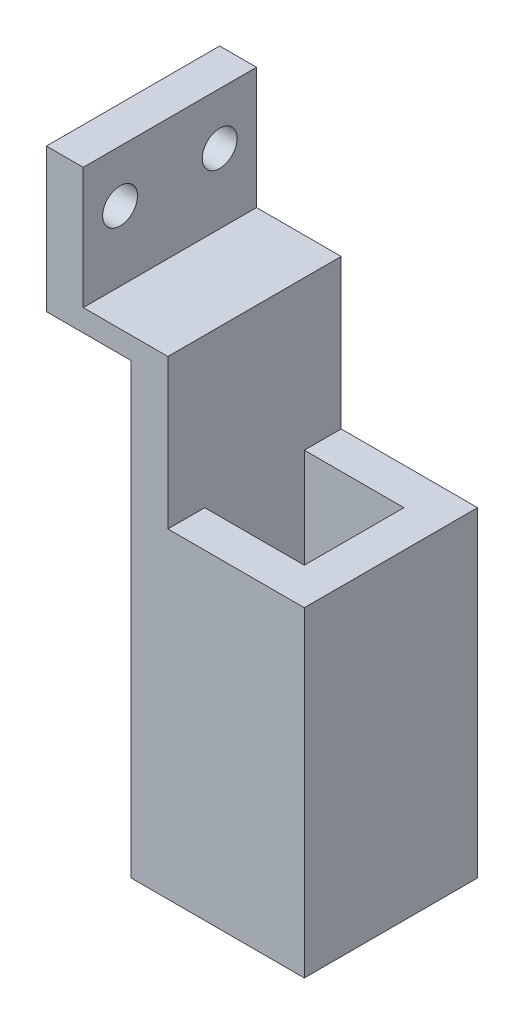
ISO-10303-21;
HEADER;
FILE_DESCRIPTION(('STEP AP214'),'2;1');
FILE_NAME('part.step','',(''),(''),'','','');
FILE_SCHEMA(('AUTOMOTIVE_DESIGN { 1 0 10303 214 1 1 1 1 }'));
ENDSEC;
DATA;
#1=APPLICATION_CONTEXT('core data for automotive mechanical design processes');
#2=APPLICATION_PROTOCOL_DEFINITION('international standard','automotive_design',2000,#1);
#3=PRODUCT_CONTEXT('',#1,'mechanical');
#4=PRODUCT('Part','Part','',(#3));
#5=PRODUCT_RELATED_PRODUCT_CATEGORY('part','',(#4));
#6=PRODUCT_DEFINITION_FORMATION('','',#4);
#7=PRODUCT_DEFINITION_CONTEXT('part definition',#1,'design');
#8=PRODUCT_DEFINITION('design','',#6,#7);
#9=PRODUCT_DEFINITION_SHAPE('','',#8);
#10=(LENGTH_UNIT() NAMED_UNIT(*) SI_UNIT(.MILLI.,.METRE.));
#11=(NAMED_UNIT(*) PLANE_ANGLE_UNIT() SI_UNIT($,.RADIAN.));
#12=(NAMED_UNIT(*) SI_UNIT($,.STERADIAN.) SOLID_ANGLE_UNIT());
#13=UNCERTAINTY_MEASURE_WITH_UNIT(LENGTH_MEASURE(1.E-05),#10,'distance_accuracy_value','');
#14=(GEOMETRIC_REPRESENTATION_CONTEXT(3) GLOBAL_UNCERTAINTY_ASSIGNED_CONTEXT((#13)) GLOBAL_UNIT_ASSIGNED_CONTEXT((#10,
#11,#12)) REPRESENTATION_CONTEXT('',''));
#15=CARTESIAN_POINT('',(0.,0.,0.));
#16=DIRECTION('',(0.,0.,1.));
#17=DIRECTION('',(1.,0.,0.));
#18=AXIS2_PLACEMENT_3D('',#15,#16,#17);
#19=CARTESIAN_POINT('',(10.,-45.,17.4));
#20=DIRECTION('',(1.,0.,0.));
#21=DIRECTION('',(0.,0.,-1.));
#22=AXIS2_PLACEMENT_3D('',#19,#20,#21);
#23=PLANE('',#22);
#24=DIRECTION('',(0.,-1.,0.));
#25=VECTOR('',#24,1.);
#26=CARTESIAN_POINT('',(10.,-15.,13.7));
#27=LINE('',#26,#25);
#28=CARTESIAN_POINT('',(10.,-15.,13.7));
#29=VERTEX_POINT('',#28);
#30=CARTESIAN_POINT('',(10.,-45.,13.7));
#31=VERTEX_POINT('',#30);
#32=EDGE_CURVE('E154',#29,#31,#27,.T.);
#33=ORIENTED_EDGE('',*,*,#32,.F.);
#34=DIRECTION('',(0.,0.,-1.));
#35=VECTOR('',#34,1.);
#36=CARTESIAN_POINT('',(10.,-15.,17.4));
#37=LINE('',#36,#35);
#38=CARTESIAN_POINT('',(10.,-15.,3.7));
#39=VERTEX_POINT('',#38);
#40=EDGE_CURVE('E164',#29,#39,#37,.T.);
#41=ORIENTED_EDGE('',*,*,#40,.T.);
#42=DIRECTION('',(0.,-1.,0.));
#43=VECTOR('',#42,1.);
#44=CARTESIAN_POINT('',(10.,-15.,3.7));
#45=LINE('',#44,#43);
#46=CARTESIAN_POINT('',(10.,-45.,3.7));
#47=VERTEX_POINT('',#46);
#48=EDGE_CURVE('E182',#39,#47,#45,.T.);
#49=ORIENTED_EDGE('',*,*,#48,.T.);
#50=DIRECTION('',(0.,0.,-1.));
#51=VECTOR('',#50,1.);
#52=CARTESIAN_POINT('',(10.,-45.,17.4));
#53=LINE('',#52,#51);
#54=EDGE_CURVE('E276',#31,#47,#53,.T.);
#55=ORIENTED_EDGE('',*,*,#54,.F.);
#56=EDGE_LOOP('',(#33,#41,#49,#55));
#57=FACE_BOUND('',#56,.T.);
#58=ADVANCED_FACE('F44',(#57),#23,.F.);
#59=CARTESIAN_POINT('',(0.,0.,17.4));
#60=DIRECTION('',(-1.,0.,0.));
#61=DIRECTION('',(0.,-1.,0.));
#62=AXIS2_PLACEMENT_3D('',#59,#60,#61);
#63=PLANE('',#62);
#64=DIRECTION('',(0.,1.,0.));
#65=VECTOR('',#64,1.);
#66=CARTESIAN_POINT('',(0.,0.,17.4));
#67=LINE('',#66,#65);
#68=CARTESIAN_POINT('',(0.,-15.,17.4));
#69=VERTEX_POINT('',#68);
#70=CARTESIAN_POINT('',(0.,0.,17.4));
#71=VERTEX_POINT('',#70);
#72=EDGE_CURVE('E167',#69,#71,#67,.T.);
#73=ORIENTED_EDGE('',*,*,#72,.F.);
#74=DIRECTION('',(0.,0.,-1.));
#75=VECTOR('',#74,1.);
#76=CARTESIAN_POINT('',(0.,-15.,17.4));
#77=LINE('',#76,#75);
#78=CARTESIAN_POINT('',(0.,-15.,13.7));
#79=VERTEX_POINT('',#78);
#80=EDGE_CURVE('E163',#69,#79,#77,.T.);
#81=ORIENTED_EDGE('',*,*,#80,.T.);
#82=DIRECTION('',(0.,-1.,0.));
#83=VECTOR('',#82,1.);
#84=CARTESIAN_POINT('',(0.,-15.,13.7));
#85=LINE('',#84,#83);
#86=CARTESIAN_POINT('',(0.,-45.,13.7));
#87=VERTEX_POINT('',#86);
#88=EDGE_CURVE('E143',#79,#87,#85,.T.);
#89=ORIENTED_EDGE('',*,*,#88,.T.);
#90=DIRECTION('',(0.,0.,-1.));
#91=VECTOR('',#90,1.);
#92=CARTESIAN_POINT('',(0.,-45.,17.4));
#93=LINE('',#92,#91);
#94=CARTESIAN_POINT('',(0.,-45.,3.7));
#95=VERTEX_POINT('',#94);
#96=EDGE_CURVE('E277',#87,#95,#93,.T.);
#97=ORIENTED_EDGE('',*,*,#96,.T.);
#98=DIRECTION('',(0.,-1.,0.));
#99=VECTOR('',#98,1.);
#100=CARTESIAN_POINT('',(0.,-15.,3.7));
#101=LINE('',#100,#99);
#102=CARTESIAN_POINT('',(0.,-15.,3.7));
#103=VERTEX_POINT('',#102);
#104=EDGE_CURVE('E189',#103,#95,#101,.T.);
#105=ORIENTED_EDGE('',*,*,#104,.F.);
#106=DIRECTION('',(0.,0.,-1.));
#107=VECTOR('',#106,1.);
#108=CARTESIAN_POINT('',(0.,-15.,0.));
#109=LINE('',#108,#107);
#110=CARTESIAN_POINT('',(0.,-15.,0.));
#111=VERTEX_POINT('',#110);
#112=EDGE_CURVE('E193',#103,#111,#109,.T.);
#113=ORIENTED_EDGE('',*,*,#112,.T.);
#114=DIRECTION('',(0.,1.,0.));
#115=VECTOR('',#114,1.);
#116=CARTESIAN_POINT('',(0.,0.,0.));
#117=LINE('',#116,#115);
#118=CARTESIAN_POINT('',(0.,0.,0.));
#119=VERTEX_POINT('',#118);
#120=EDGE_CURVE('E249',#111,#119,#117,.T.);
#121=ORIENTED_EDGE('',*,*,#120,.T.);
#122=DIRECTION('',(0.,0.,-1.));
#123=VECTOR('',#122,1.);
#124=CARTESIAN_POINT('',(0.,0.,17.4));
#125=LINE('',#124,#123);
#126=EDGE_CURVE('E275',#71,#119,#125,.T.);
#127=ORIENTED_EDGE('',*,*,#126,.F.);
#128=EDGE_LOOP('',(#73,#81,#89,#97,#105,#113,#121,#127));
#129=FACE_BOUND('',#128,.T.);
#130=ADVANCED_FACE('F166',(#129),#63,.F.);
#131=CARTESIAN_POINT('',(-12.2,-2.2,17.4));
#132=DIRECTION('',(1.,0.,0.));
#133=DIRECTION('',(0.,1.,0.));
#134=AXIS2_PLACEMENT_3D('',#131,#132,#133);
#135=PLANE('',#134);
#136=CARTESIAN_POINT('',(-12.2,7.,13.7));
#137=DIRECTION('',(1.,0.,0.));
#138=DIRECTION('',(0.,0.,-1.));
#139=AXIS2_PLACEMENT_3D('',#136,#137,#138);
#140=CIRCLE('',#139,1.75);
#141=CARTESIAN_POINT('',(-12.2,7.,11.95));
#142=VERTEX_POINT('',#141);
#143=EDGE_CURVE('E192',#142,#142,#140,.T.);
#144=ORIENTED_EDGE('',*,*,#143,.T.);
#145=EDGE_LOOP('',(#144));
#146=FACE_BOUND('',#145,.T.);
#147=CARTESIAN_POINT('',(-12.2,7.,3.7));
#148=DIRECTION('',(1.,0.,0.));
#149=DIRECTION('',(0.,0.,-1.));
#150=AXIS2_PLACEMENT_3D('',#147,#148,#149);
#151=CIRCLE('',#150,1.75);
#152=CARTESIAN_POINT('',(-12.2,7.,1.95));
#153=VERTEX_POINT('',#152);
#154=EDGE_CURVE('E180',#153,#153,#151,.T.);
#155=ORIENTED_EDGE('',*,*,#154,.T.);
#156=EDGE_LOOP('',(#155));
#157=FACE_BOUND('',#156,.T.);
#158=DIRECTION('',(0.,-1.,0.));
#159=VECTOR('',#158,1.);
#160=CARTESIAN_POINT('',(-12.2,-2.2,0.));
#161=LINE('',#160,#159);
#162=CARTESIAN_POINT('',(-12.2,12.2,0.));
#163=VERTEX_POINT('',#162);
#164=CARTESIAN_POINT('',(-12.2,-2.2,0.));
#165=VERTEX_POINT('',#164);
#166=EDGE_CURVE('E181',#163,#165,#161,.T.);
#167=ORIENTED_EDGE('',*,*,#166,.T.);
#168=DIRECTION('',(0.,0.,-1.));
#169=VECTOR('',#168,1.);
#170=CARTESIAN_POINT('',(-12.2,-2.2,17.4));
#171=LINE('',#170,#169);
#172=CARTESIAN_POINT('',(-12.2,-2.2,17.4));
#173=VERTEX_POINT('',#172);
#174=EDGE_CURVE('E11',#173,#165,#171,.T.);
#175=ORIENTED_EDGE('',*,*,#174,.F.);
#176=DIRECTION('',(0.,-1.,0.));
#177=VECTOR('',#176,1.);
#178=CARTESIAN_POINT('',(-12.2,-2.2,17.4));
#179=LINE('',#178,#177);
#180=CARTESIAN_POINT('',(-12.2,12.2,17.4));
#181=VERTEX_POINT('',#180);
#182=EDGE_CURVE('E202',#181,#173,#179,.T.);
#183=ORIENTED_EDGE('',*,*,#182,.F.);
#184=DIRECTION('',(0.,0.,-1.));
#185=VECTOR('',#184,1.);
#186=CARTESIAN_POINT('',(-12.2,12.2,17.4));
#187=LINE('',#186,#185);
#188=EDGE_CURVE('E235',#181,#163,#187,.T.);
#189=ORIENTED_EDGE('',*,*,#188,.T.);
#190=EDGE_LOOP('',(#167,#175,#183,#189));
#191=FACE_BOUND('',#190,.T.);
#192=ADVANCED_FACE('F50',(#146,#157,#191),#135,.F.);
#193=CARTESIAN_POINT('',(-3.7,-2.2,17.4));
#194=DIRECTION('',(0.,1.,0.));
#195=DIRECTION('',(-1.,0.,0.));
#196=AXIS2_PLACEMENT_3D('',#193,#194,#195);
#197=PLANE('',#196);
#198=DIRECTION('',(1.,0.,0.));
#199=VECTOR('',#198,1.);
#200=CARTESIAN_POINT('',(-3.7,-2.2,0.));
#201=LINE('',#200,#199);
#202=CARTESIAN_POINT('',(-3.7,-2.2,0.));
#203=VERTEX_POINT('',#202);
#204=EDGE_CURVE('E236',#165,#203,#201,.T.);
#205=ORIENTED_EDGE('',*,*,#204,.T.);
#206=DIRECTION('',(0.,0.,-1.));
#207=VECTOR('',#206,1.);
#208=CARTESIAN_POINT('',(-3.7,-2.2,17.4));
#209=LINE('',#208,#207);
#210=CARTESIAN_POINT('',(-3.7,-2.2,17.4));
#211=VERTEX_POINT('',#210);
#212=EDGE_CURVE('E53',#211,#203,#209,.T.);
#213=ORIENTED_EDGE('',*,*,#212,.F.);
#214=DIRECTION('',(1.,0.,0.));
#215=VECTOR('',#214,1.);
#216=CARTESIAN_POINT('',(-3.7,-2.2,17.4));
#217=LINE('',#216,#215);
#218=EDGE_CURVE('E201',#173,#211,#217,.T.);
#219=ORIENTED_EDGE('',*,*,#218,.F.);
#220=ORIENTED_EDGE('',*,*,#174,.T.);
#221=EDGE_LOOP('',(#205,#213,#219,#220));
#222=FACE_BOUND('',#221,.T.);
#223=ADVANCED_FACE('F322',(#222),#197,.F.);
#224=CARTESIAN_POINT('',(-3.7,-47.2,17.4));
#225=DIRECTION('',(1.,0.,0.));
#226=DIRECTION('',(0.,1.,0.));
#227=AXIS2_PLACEMENT_3D('',#224,#225,#226);
#228=PLANE('',#227);
#229=DIRECTION('',(0.,-1.,0.));
#230=VECTOR('',#229,1.);
#231=CARTESIAN_POINT('',(-3.7,-47.2,0.));
#232=LINE('',#231,#230);
#233=CARTESIAN_POINT('',(-3.7,-47.2,0.));
#234=VERTEX_POINT('',#233);
#235=EDGE_CURVE('E237',#203,#234,#232,.T.);
#236=ORIENTED_EDGE('',*,*,#235,.T.);
#237=DIRECTION('',(0.,0.,-1.));
#238=VECTOR('',#237,1.);
#239=CARTESIAN_POINT('',(-3.7,-47.2,17.4));
#240=LINE('',#239,#238);
#241=CARTESIAN_POINT('',(-3.7,-47.2,17.4));
#242=VERTEX_POINT('',#241);
#243=EDGE_CURVE('E292',#242,#234,#240,.T.);
#244=ORIENTED_EDGE('',*,*,#243,.F.);
#245=DIRECTION('',(0.,-1.,0.));
#246=VECTOR('',#245,1.);
#247=CARTESIAN_POINT('',(-3.7,-47.2,17.4));
#248=LINE('',#247,#246);
#249=EDGE_CURVE('E209',#211,#242,#248,.T.);
#250=ORIENTED_EDGE('',*,*,#249,.F.);
#251=ORIENTED_EDGE('',*,*,#212,.T.);
#252=EDGE_LOOP('',(#236,#244,#250,#251));
#253=FACE_BOUND('',#252,.T.);
#254=ADVANCED_FACE('F301',(#253),#228,.F.);
#255=CARTESIAN_POINT('',(13.7,-47.2,17.4));
#256=DIRECTION('',(0.,1.,0.));
#257=DIRECTION('',(-1.,0.,0.));
#258=AXIS2_PLACEMENT_3D('',#255,#256,#257);
#259=PLANE('',#258);
#260=DIRECTION('',(1.,0.,0.));
#261=VECTOR('',#260,1.);
#262=CARTESIAN_POINT('',(13.7,-47.2,0.));
#263=LINE('',#262,#261);
#264=CARTESIAN_POINT('',(13.7,-47.2,0.));
#265=VERTEX_POINT('',#264);
#266=EDGE_CURVE('E245',#234,#265,#263,.T.);
#267=ORIENTED_EDGE('',*,*,#266,.T.);
#268=DIRECTION('',(0.,0.,-1.));
#269=VECTOR('',#268,1.);
#270=CARTESIAN_POINT('',(13.7,-47.2,17.4));
#271=LINE('',#270,#269);
#272=CARTESIAN_POINT('',(13.7,-47.2,17.4));
#273=VERTEX_POINT('',#272);
#274=EDGE_CURVE('E288',#273,#265,#271,.T.);
#275=ORIENTED_EDGE('',*,*,#274,.F.);
#276=DIRECTION('',(1.,0.,0.));
#277=VECTOR('',#276,1.);
#278=CARTESIAN_POINT('',(13.7,-47.2,17.4));
#279=LINE('',#278,#277);
#280=EDGE_CURVE('E215',#242,#273,#279,.T.);
#281=ORIENTED_EDGE('',*,*,#280,.F.);
#282=ORIENTED_EDGE('',*,*,#243,.T.);
#283=EDGE_LOOP('',(#267,#275,#281,#282));
#284=FACE_BOUND('',#283,.T.);
#285=ADVANCED_FACE('F311',(#284),#259,.F.);
#286=CARTESIAN_POINT('',(13.7,-15.,17.4));
#287=DIRECTION('',(-1.,0.,0.));
#288=DIRECTION('',(0.,-1.,0.));
#289=AXIS2_PLACEMENT_3D('',#286,#287,#288);
#290=PLANE('',#289);
#291=DIRECTION('',(0.,1.,0.));
#292=VECTOR('',#291,1.);
#293=CARTESIAN_POINT('',(13.7,-15.,0.));
#294=LINE('',#293,#292);
#295=CARTESIAN_POINT('',(13.7,-15.,0.));
#296=VERTEX_POINT('',#295);
#297=EDGE_CURVE('E244',#265,#296,#294,.T.);
#298=ORIENTED_EDGE('',*,*,#297,.T.);
#299=DIRECTION('',(0.,0.,-1.));
#300=VECTOR('',#299,1.);
#301=CARTESIAN_POINT('',(13.7,-15.,17.4));
#302=LINE('',#301,#300);
#303=CARTESIAN_POINT('',(13.7,-15.,17.4));
#304=VERTEX_POINT('',#303);
#305=EDGE_CURVE('E284',#304,#296,#302,.T.);
#306=ORIENTED_EDGE('',*,*,#305,.F.);
#307=DIRECTION('',(0.,1.,0.));
#308=VECTOR('',#307,1.);
#309=CARTESIAN_POINT('',(13.7,-15.,17.4));
#310=LINE('',#309,#308);
#311=EDGE_CURVE('E213',#273,#304,#310,.T.);
#312=ORIENTED_EDGE('',*,*,#311,.F.);
#313=ORIENTED_EDGE('',*,*,#274,.T.);
#314=EDGE_LOOP('',(#298,#306,#312,#313));
#315=FACE_BOUND('',#314,.T.);
#316=ADVANCED_FACE('F314',(#315),#290,.F.);
#317=CARTESIAN_POINT('',(10.,-15.,17.4));
#318=DIRECTION('',(0.,-1.,0.));
#319=DIRECTION('',(0.,0.,-1.));
#320=AXIS2_PLACEMENT_3D('',#317,#318,#319);
#321=PLANE('',#320);
#322=DIRECTION('',(-1.,0.,0.));
#323=VECTOR('',#322,1.);
#324=CARTESIAN_POINT('',(10.,-15.,0.));
#325=LINE('',#324,#323);
#326=EDGE_CURVE('E68',#296,#111,#325,.T.);
#327=ORIENTED_EDGE('',*,*,#326,.T.);
#328=ORIENTED_EDGE('',*,*,#112,.F.);
#329=DIRECTION('',(-1.,0.,0.));
#330=VECTOR('',#329,1.);
#331=CARTESIAN_POINT('',(0.,-15.,3.7));
#332=LINE('',#331,#330);
#333=EDGE_CURVE('E190',#39,#103,#332,.T.);
#334=ORIENTED_EDGE('',*,*,#333,.F.);
#335=ORIENTED_EDGE('',*,*,#40,.F.);
#336=DIRECTION('',(1.,0.,0.));
#337=VECTOR('',#336,1.);
#338=CARTESIAN_POINT('',(0.,-15.,13.7));
#339=LINE('',#338,#337);
#340=EDGE_CURVE('E149',#79,#29,#339,.T.);
#341=ORIENTED_EDGE('',*,*,#340,.F.);
#342=ORIENTED_EDGE('',*,*,#80,.F.);
#343=DIRECTION('',(-1.,0.,0.));
#344=VECTOR('',#343,1.);
#345=CARTESIAN_POINT('',(10.,-15.,17.4));
#346=LINE('',#345,#344);
#347=EDGE_CURVE('E217',#304,#69,#346,.T.);
#348=ORIENTED_EDGE('',*,*,#347,.F.);
#349=ORIENTED_EDGE('',*,*,#305,.T.);
#350=EDGE_LOOP('',(#327,#328,#334,#335,#341,#342,#348,#349));
#351=FACE_BOUND('',#350,.T.);
#352=ADVANCED_FACE('F159',(#351),#321,.F.);
#353=CARTESIAN_POINT('',(0.,-45.,17.4));
#354=DIRECTION('',(0.,-1.,0.));
#355=DIRECTION('',(0.,0.,-1.));
#356=AXIS2_PLACEMENT_3D('',#353,#354,#355);
#357=PLANE('',#356);
#358=ORIENTED_EDGE('',*,*,#96,.F.);
#359=DIRECTION('',(1.,0.,0.));
#360=VECTOR('',#359,1.);
#361=CARTESIAN_POINT('',(0.,-45.,13.7));
#362=LINE('',#361,#360);
#363=EDGE_CURVE('E62',#87,#31,#362,.T.);
#364=ORIENTED_EDGE('',*,*,#363,.T.);
#365=ORIENTED_EDGE('',*,*,#54,.T.);
#366=DIRECTION('',(-1.,0.,0.));
#367=VECTOR('',#366,1.);
#368=CARTESIAN_POINT('',(0.,-45.,3.7));
#369=LINE('',#368,#367);
#370=EDGE_CURVE('E172',#47,#95,#369,.T.);
#371=ORIENTED_EDGE('',*,*,#370,.T.);
#372=EDGE_LOOP('',(#358,#364,#365,#371));
#373=FACE_BOUND('',#372,.T.);
#374=ADVANCED_FACE('F343',(#373),#357,.F.);
#375=CARTESIAN_POINT('',(-8.5,0.,17.4));
#376=DIRECTION('',(0.,-1.,0.));
#377=DIRECTION('',(0.,0.,-1.));
#378=AXIS2_PLACEMENT_3D('',#375,#376,#377);
#379=PLANE('',#378);
#380=DIRECTION('',(-1.,0.,0.));
#381=VECTOR('',#380,1.);
#382=CARTESIAN_POINT('',(-8.5,0.,0.));
#383=LINE('',#382,#381);
#384=CARTESIAN_POINT('',(-8.5,0.,0.));
#385=VERTEX_POINT('',#384);
#386=EDGE_CURVE('E254',#119,#385,#383,.T.);
#387=ORIENTED_EDGE('',*,*,#386,.T.);
#388=DIRECTION('',(0.,0.,-1.));
#389=VECTOR('',#388,1.);
#390=CARTESIAN_POINT('',(-8.5,0.,17.4));
#391=LINE('',#390,#389);
#392=CARTESIAN_POINT('',(-8.5,0.,17.4));
#393=VERTEX_POINT('',#392);
#394=EDGE_CURVE('E268',#393,#385,#391,.T.);
#395=ORIENTED_EDGE('',*,*,#394,.F.);
#396=DIRECTION('',(-1.,0.,0.));
#397=VECTOR('',#396,1.);
#398=CARTESIAN_POINT('',(-8.5,0.,17.4));
#399=LINE('',#398,#397);
#400=EDGE_CURVE('E223',#71,#393,#399,.T.);
#401=ORIENTED_EDGE('',*,*,#400,.F.);
#402=ORIENTED_EDGE('',*,*,#126,.T.);
#403=EDGE_LOOP('',(#387,#395,#401,#402));
#404=FACE_BOUND('',#403,.T.);
#405=ADVANCED_FACE('F340',(#404),#379,.F.);
#406=CARTESIAN_POINT('',(-8.5,12.2,17.4));
#407=DIRECTION('',(-1.,0.,0.));
#408=DIRECTION('',(0.,0.,1.));
#409=AXIS2_PLACEMENT_3D('',#406,#407,#408);
#410=PLANE('',#409);
#411=CARTESIAN_POINT('',(-8.5,7.,13.7));
#412=DIRECTION('',(1.,0.,0.));
#413=DIRECTION('',(0.,0.,-1.));
#414=AXIS2_PLACEMENT_3D('',#411,#412,#413);
#415=CIRCLE('',#414,1.75);
#416=CARTESIAN_POINT('',(-8.5,7.,11.95));
#417=VERTEX_POINT('',#416);
#418=EDGE_CURVE('E390',#417,#417,#415,.T.);
#419=ORIENTED_EDGE('',*,*,#418,.F.);
#420=EDGE_LOOP('',(#419));
#421=FACE_BOUND('',#420,.T.);
#422=CARTESIAN_POINT('',(-8.5,7.,3.7));
#423=DIRECTION('',(1.,0.,0.));
#424=DIRECTION('',(0.,0.,-1.));
#425=AXIS2_PLACEMENT_3D('',#422,#423,#424);
#426=CIRCLE('',#425,1.75);
#427=CARTESIAN_POINT('',(-8.5,7.,1.95));
#428=VERTEX_POINT('',#427);
#429=EDGE_CURVE('E381',#428,#428,#426,.T.);
#430=ORIENTED_EDGE('',*,*,#429,.F.);
#431=EDGE_LOOP('',(#430));
#432=FACE_BOUND('',#431,.T.);
#433=DIRECTION('',(0.,1.,0.));
#434=VECTOR('',#433,1.);
#435=CARTESIAN_POINT('',(-8.5,12.2,0.));
#436=LINE('',#435,#434);
#437=CARTESIAN_POINT('',(-8.5,12.2,0.));
#438=VERTEX_POINT('',#437);
#439=EDGE_CURVE('E257',#385,#438,#436,.T.);
#440=ORIENTED_EDGE('',*,*,#439,.T.);
#441=DIRECTION('',(0.,0.,-1.));
#442=VECTOR('',#441,1.);
#443=CARTESIAN_POINT('',(-8.5,12.2,17.4));
#444=LINE('',#443,#442);
#445=CARTESIAN_POINT('',(-8.5,12.2,17.4));
#446=VERTEX_POINT('',#445);
#447=EDGE_CURVE('E263',#446,#438,#444,.T.);
#448=ORIENTED_EDGE('',*,*,#447,.F.);
#449=DIRECTION('',(0.,1.,0.));
#450=VECTOR('',#449,1.);
#451=CARTESIAN_POINT('',(-8.5,12.2,17.4));
#452=LINE('',#451,#450);
#453=EDGE_CURVE('E228',#393,#446,#452,.T.);
#454=ORIENTED_EDGE('',*,*,#453,.F.);
#455=ORIENTED_EDGE('',*,*,#394,.T.);
#456=EDGE_LOOP('',(#440,#448,#454,#455));
#457=FACE_BOUND('',#456,.T.);
#458=ADVANCED_FACE('F333',(#421,#432,#457),#410,.F.);
#459=CARTESIAN_POINT('',(-12.2,12.2,17.4));
#460=DIRECTION('',(0.,-1.,0.));
#461=DIRECTION('',(0.,0.,-1.));
#462=AXIS2_PLACEMENT_3D('',#459,#460,#461);
#463=PLANE('',#462);
#464=DIRECTION('',(-1.,0.,0.));
#465=VECTOR('',#464,1.);
#466=CARTESIAN_POINT('',(-12.2,12.2,0.));
#467=LINE('',#466,#465);
#468=EDGE_CURVE('E207',#438,#163,#467,.T.);
#469=ORIENTED_EDGE('',*,*,#468,.T.);
#470=ORIENTED_EDGE('',*,*,#188,.F.);
#471=DIRECTION('',(-1.,0.,0.));
#472=VECTOR('',#471,1.);
#473=CARTESIAN_POINT('',(-12.2,12.2,17.4));
#474=LINE('',#473,#472);
#475=EDGE_CURVE('E230',#446,#181,#474,.T.);
#476=ORIENTED_EDGE('',*,*,#475,.F.);
#477=ORIENTED_EDGE('',*,*,#447,.T.);
#478=EDGE_LOOP('',(#469,#470,#476,#477));
#479=FACE_BOUND('',#478,.T.);
#480=ADVANCED_FACE('F327',(#479),#463,.F.);
#481=CARTESIAN_POINT('',(0.,0.,17.4));
#482=DIRECTION('',(0.,0.,-1.));
#483=DIRECTION('',(-1.,0.,0.));
#484=AXIS2_PLACEMENT_3D('',#481,#482,#483);
#485=PLANE('',#484);
#486=ORIENTED_EDGE('',*,*,#182,.T.);
#487=ORIENTED_EDGE('',*,*,#218,.T.);
#488=ORIENTED_EDGE('',*,*,#249,.T.);
#489=ORIENTED_EDGE('',*,*,#280,.T.);
#490=ORIENTED_EDGE('',*,*,#311,.T.);
#491=ORIENTED_EDGE('',*,*,#347,.T.);
#492=ORIENTED_EDGE('',*,*,#72,.T.);
#493=ORIENTED_EDGE('',*,*,#400,.T.);
#494=ORIENTED_EDGE('',*,*,#453,.T.);
#495=ORIENTED_EDGE('',*,*,#475,.T.);
#496=EDGE_LOOP('',(#486,#487,#488,#489,#490,#491,#492,#493,#494,#495));
#497=FACE_BOUND('',#496,.T.);
#498=ADVANCED_FACE('F319',(#497),#485,.F.);
#499=CARTESIAN_POINT('',(0.,0.,0.));
#500=DIRECTION('',(0.,0.,-1.));
#501=DIRECTION('',(-1.,0.,0.));
#502=AXIS2_PLACEMENT_3D('',#499,#500,#501);
#503=PLANE('',#502);
#504=ORIENTED_EDGE('',*,*,#166,.F.);
#505=ORIENTED_EDGE('',*,*,#468,.F.);
#506=ORIENTED_EDGE('',*,*,#439,.F.);
#507=ORIENTED_EDGE('',*,*,#386,.F.);
#508=ORIENTED_EDGE('',*,*,#120,.F.);
#509=ORIENTED_EDGE('',*,*,#326,.F.);
#510=ORIENTED_EDGE('',*,*,#297,.F.);
#511=ORIENTED_EDGE('',*,*,#266,.F.);
#512=ORIENTED_EDGE('',*,*,#235,.F.);
#513=ORIENTED_EDGE('',*,*,#204,.F.);
#514=EDGE_LOOP('',(#504,#505,#506,#507,#508,#509,#510,#511,#512,#513));
#515=FACE_BOUND('',#514,.T.);
#516=ADVANCED_FACE('F310',(#515),#503,.T.);
#517=CARTESIAN_POINT('',(0.,-15.,3.7));
#518=DIRECTION('',(0.,0.,1.));
#519=DIRECTION('',(1.,0.,0.));
#520=AXIS2_PLACEMENT_3D('',#517,#518,#519);
#521=PLANE('',#520);
#522=ORIENTED_EDGE('',*,*,#370,.F.);
#523=ORIENTED_EDGE('',*,*,#48,.F.);
#524=ORIENTED_EDGE('',*,*,#333,.T.);
#525=ORIENTED_EDGE('',*,*,#104,.T.);
#526=EDGE_LOOP('',(#522,#523,#524,#525));
#527=FACE_BOUND('',#526,.T.);
#528=ADVANCED_FACE('F342',(#527),#521,.T.);
#529=CARTESIAN_POINT('',(0.,-15.,13.7));
#530=DIRECTION('',(0.,0.,-1.));
#531=DIRECTION('',(-1.,0.,0.));
#532=AXIS2_PLACEMENT_3D('',#529,#530,#531);
#533=PLANE('',#532);
#534=ORIENTED_EDGE('',*,*,#363,.F.);
#535=ORIENTED_EDGE('',*,*,#88,.F.);
#536=ORIENTED_EDGE('',*,*,#340,.T.);
#537=ORIENTED_EDGE('',*,*,#32,.T.);
#538=EDGE_LOOP('',(#534,#535,#536,#537));
#539=FACE_BOUND('',#538,.T.);
#540=ADVANCED_FACE('F150',(#539),#533,.T.);
#541=CARTESIAN_POINT('',(-12.2,7.,3.7));
#542=DIRECTION('',(1.,0.,0.));
#543=DIRECTION('',(0.,0.,-1.));
#544=AXIS2_PLACEMENT_3D('',#541,#542,#543);
#545=CYLINDRICAL_SURFACE('',#544,1.75);
#546=ORIENTED_EDGE('',*,*,#154,.F.);
#547=EDGE_LOOP('',(#546));
#548=FACE_BOUND('',#547,.T.);
#549=ORIENTED_EDGE('',*,*,#429,.T.);
#550=EDGE_LOOP('',(#549));
#551=FACE_BOUND('',#550,.T.);
#552=ADVANCED_FACE('F415',(#548,#551),#545,.F.);
#553=CARTESIAN_POINT('',(-12.2,7.,13.7));
#554=DIRECTION('',(1.,0.,0.));
#555=DIRECTION('',(0.,0.,-1.));
#556=AXIS2_PLACEMENT_3D('',#553,#554,#555);
#557=CYLINDRICAL_SURFACE('',#556,1.75);
#558=ORIENTED_EDGE('',*,*,#143,.F.);
#559=EDGE_LOOP('',(#558));
#560=FACE_BOUND('',#559,.T.);
#561=ORIENTED_EDGE('',*,*,#418,.T.);
#562=EDGE_LOOP('',(#561));
#563=FACE_BOUND('',#562,.T.);
#564=ADVANCED_FACE('F400',(#560,#563),#557,.F.);
#565=CLOSED_SHELL('',(#58,#130,#192,#223,#254,#285,#316,#352,#374,#405,#458,#480,#498,#516,#528,
#540,#552,#564));
#566=MANIFOLD_SOLID_BREP('B2',#565);
#567=ADVANCED_BREP_SHAPE_REPRESENTATION('',(#18,#566),#14);
#568=SHAPE_DEFINITION_REPRESENTATION(#9,#567);
ENDSEC;
END-ISO-10303-21;
